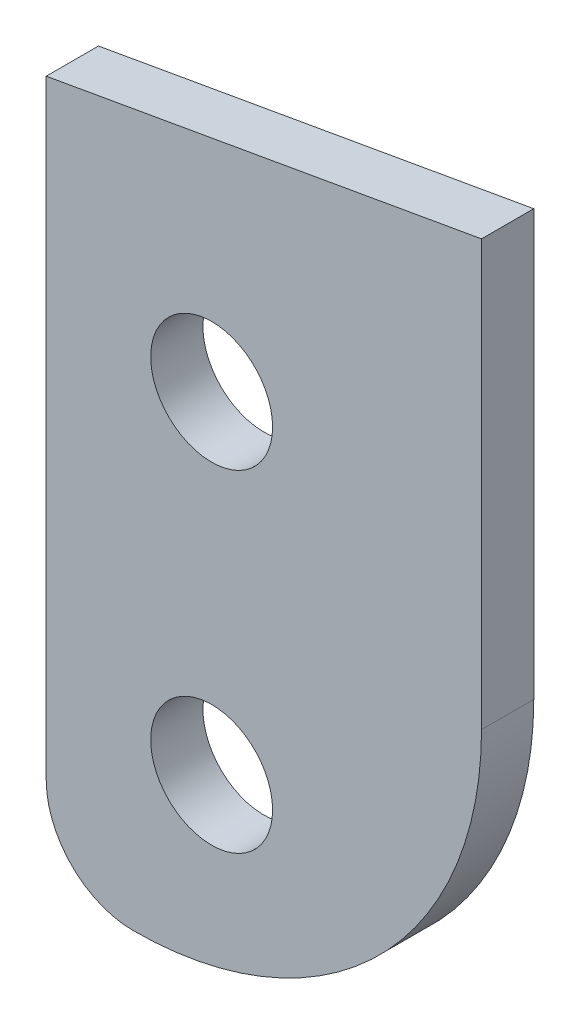
ISO-10303-21;
HEADER;
FILE_DESCRIPTION(('STEP AP214'),'2;1');
FILE_NAME('part.step','',(''),(''),'','','');
FILE_SCHEMA(('AUTOMOTIVE_DESIGN { 1 0 10303 214 1 1 1 1 }'));
ENDSEC;
DATA;
#1=APPLICATION_CONTEXT('core data for automotive mechanical design processes');
#2=APPLICATION_PROTOCOL_DEFINITION('international standard','automotive_design',2000,#1);
#3=PRODUCT_CONTEXT('',#1,'mechanical');
#4=PRODUCT('Part','Part','',(#3));
#5=PRODUCT_RELATED_PRODUCT_CATEGORY('part','',(#4));
#6=PRODUCT_DEFINITION_FORMATION('','',#4);
#7=PRODUCT_DEFINITION_CONTEXT('part definition',#1,'design');
#8=PRODUCT_DEFINITION('design','',#6,#7);
#9=PRODUCT_DEFINITION_SHAPE('','',#8);
#10=(LENGTH_UNIT() NAMED_UNIT(*) SI_UNIT(.MILLI.,.METRE.));
#11=(NAMED_UNIT(*) PLANE_ANGLE_UNIT() SI_UNIT($,.RADIAN.));
#12=(NAMED_UNIT(*) SI_UNIT($,.STERADIAN.) SOLID_ANGLE_UNIT());
#13=UNCERTAINTY_MEASURE_WITH_UNIT(LENGTH_MEASURE(1.E-05),#10,'distance_accuracy_value','');
#14=(GEOMETRIC_REPRESENTATION_CONTEXT(3) GLOBAL_UNCERTAINTY_ASSIGNED_CONTEXT((#13)) GLOBAL_UNIT_ASSIGNED_CONTEXT((#10,
#11,#12)) REPRESENTATION_CONTEXT('',''));
#15=CARTESIAN_POINT('',(0.,0.,0.));
#16=DIRECTION('',(0.,0.,1.));
#17=DIRECTION('',(1.,0.,0.));
#18=AXIS2_PLACEMENT_3D('',#15,#16,#17);
#19=CARTESIAN_POINT('',(50.,0.,6.));
#20=DIRECTION('',(-1.,0.,0.));
#21=DIRECTION('',(0.,-1.,0.));
#22=AXIS2_PLACEMENT_3D('',#19,#20,#21);
#23=PLANE('',#22);
#24=DIRECTION('',(0.,1.,0.));
#25=VECTOR('',#24,1.);
#26=CARTESIAN_POINT('',(50.,0.,6.));
#27=LINE('',#26,#25);
#28=CARTESIAN_POINT('',(50.,40.,6.));
#29=VERTEX_POINT('',#28);
#30=CARTESIAN_POINT('',(50.,88.8163490354231,6.));
#31=VERTEX_POINT('',#30);
#32=EDGE_CURVE('E90',#29,#31,#27,.T.);
#33=ORIENTED_EDGE('',*,*,#32,.F.);
#34=DIRECTION('',(0.,0.,-1.));
#35=VECTOR('',#34,1.);
#36=CARTESIAN_POINT('',(50.,40.,6.));
#37=LINE('',#36,#35);
#38=CARTESIAN_POINT('',(50.,40.,0.));
#39=VERTEX_POINT('',#38);
#40=EDGE_CURVE('E117',#29,#39,#37,.T.);
#41=ORIENTED_EDGE('',*,*,#40,.T.);
#42=DIRECTION('',(0.,1.,0.));
#43=VECTOR('',#42,1.);
#44=CARTESIAN_POINT('',(50.,0.,0.));
#45=LINE('',#44,#43);
#46=CARTESIAN_POINT('',(50.,88.8163490354231,0.));
#47=VERTEX_POINT('',#46);
#48=EDGE_CURVE('E114',#39,#47,#45,.T.);
#49=ORIENTED_EDGE('',*,*,#48,.T.);
#50=DIRECTION('',(0.,0.,-1.));
#51=VECTOR('',#50,1.);
#52=CARTESIAN_POINT('',(50.,88.8163490354231,6.));
#53=LINE('',#52,#51);
#54=EDGE_CURVE('E107',#31,#47,#53,.T.);
#55=ORIENTED_EDGE('',*,*,#54,.F.);
#56=EDGE_LOOP('',(#33,#41,#49,#55));
#57=FACE_BOUND('',#56,.T.);
#58=ADVANCED_FACE('F43',(#57),#23,.F.);
#59=CARTESIAN_POINT('',(0.,80.,6.));
#60=DIRECTION('',(0.173648177666927,-0.984807753012209,0.));
#61=DIRECTION('',(0.984807753012209,0.173648177666927,0.));
#62=AXIS2_PLACEMENT_3D('',#59,#60,#61);
#63=PLANE('',#62);
#64=DIRECTION('',(-0.984807753012209,-0.173648177666927,0.));
#65=VECTOR('',#64,1.);
#66=CARTESIAN_POINT('',(0.,80.,0.));
#67=LINE('',#66,#65);
#68=CARTESIAN_POINT('',(0.,80.,0.));
#69=VERTEX_POINT('',#68);
#70=EDGE_CURVE('E150',#47,#69,#67,.T.);
#71=ORIENTED_EDGE('',*,*,#70,.T.);
#72=DIRECTION('',(0.,0.,-1.));
#73=VECTOR('',#72,1.);
#74=CARTESIAN_POINT('',(0.,80.,6.));
#75=LINE('',#74,#73);
#76=CARTESIAN_POINT('',(0.,80.,6.));
#77=VERTEX_POINT('',#76);
#78=EDGE_CURVE('E109',#77,#69,#75,.T.);
#79=ORIENTED_EDGE('',*,*,#78,.F.);
#80=DIRECTION('',(-0.984807753012209,-0.173648177666927,0.));
#81=VECTOR('',#80,1.);
#82=CARTESIAN_POINT('',(0.,80.,6.));
#83=LINE('',#82,#81);
#84=EDGE_CURVE('E93',#31,#77,#83,.T.);
#85=ORIENTED_EDGE('',*,*,#84,.F.);
#86=ORIENTED_EDGE('',*,*,#54,.T.);
#87=EDGE_LOOP('',(#71,#79,#85,#86));
#88=FACE_BOUND('',#87,.T.);
#89=ADVANCED_FACE('F106',(#88),#63,.F.);
#90=CARTESIAN_POINT('',(0.,0.,6.));
#91=DIRECTION('',(1.,0.,0.));
#92=DIRECTION('',(0.,0.,-1.));
#93=AXIS2_PLACEMENT_3D('',#90,#91,#92);
#94=PLANE('',#93);
#95=DIRECTION('',(0.,-1.,0.));
#96=VECTOR('',#95,1.);
#97=CARTESIAN_POINT('',(0.,0.,0.));
#98=LINE('',#97,#96);
#99=CARTESIAN_POINT('',(0.,10.,0.));
#100=VERTEX_POINT('',#99);
#101=EDGE_CURVE('E102',#69,#100,#98,.T.);
#102=ORIENTED_EDGE('',*,*,#101,.T.);
#103=DIRECTION('',(0.,0.,-1.));
#104=VECTOR('',#103,1.);
#105=CARTESIAN_POINT('',(0.,10.,6.));
#106=LINE('',#105,#104);
#107=CARTESIAN_POINT('',(0.,10.,6.));
#108=VERTEX_POINT('',#107);
#109=EDGE_CURVE('E52',#100,#108,#106,.F.);
#110=ORIENTED_EDGE('',*,*,#109,.T.);
#111=DIRECTION('',(0.,-1.,0.));
#112=VECTOR('',#111,1.);
#113=CARTESIAN_POINT('',(0.,0.,6.));
#114=LINE('',#113,#112);
#115=EDGE_CURVE('E111',#77,#108,#114,.T.);
#116=ORIENTED_EDGE('',*,*,#115,.F.);
#117=ORIENTED_EDGE('',*,*,#78,.T.);
#118=EDGE_LOOP('',(#102,#110,#116,#117));
#119=FACE_BOUND('',#118,.T.);
#120=ADVANCED_FACE('F164',(#119),#94,.F.);
#121=CARTESIAN_POINT('',(0.,0.,6.));
#122=DIRECTION('',(0.,0.,-1.));
#123=DIRECTION('',(-1.,0.,0.));
#124=AXIS2_PLACEMENT_3D('',#121,#122,#123);
#125=PLANE('',#124);
#126=CARTESIAN_POINT('',(19.,58.1,6.));
#127=DIRECTION('',(0.,0.,1.));
#128=DIRECTION('',(1.,0.,0.));
#129=AXIS2_PLACEMENT_3D('',#126,#127,#128);
#130=CIRCLE('',#129,7.);
#131=CARTESIAN_POINT('',(26.,58.1,6.));
#132=VERTEX_POINT('',#131);
#133=EDGE_CURVE('E152',#132,#132,#130,.T.);
#134=ORIENTED_EDGE('',*,*,#133,.F.);
#135=EDGE_LOOP('',(#134));
#136=FACE_BOUND('',#135,.T.);
#137=CARTESIAN_POINT('',(19.,20.,6.));
#138=DIRECTION('',(0.,0.,1.));
#139=DIRECTION('',(1.,0.,0.));
#140=AXIS2_PLACEMENT_3D('',#137,#138,#139);
#141=CIRCLE('',#140,7.);
#142=CARTESIAN_POINT('',(26.,20.,6.));
#143=VERTEX_POINT('',#142);
#144=EDGE_CURVE('E211',#143,#143,#141,.T.);
#145=ORIENTED_EDGE('',*,*,#144,.F.);
#146=EDGE_LOOP('',(#145));
#147=FACE_BOUND('',#146,.T.);
#148=ORIENTED_EDGE('',*,*,#115,.T.);
#149=CARTESIAN_POINT('',(10.,10.,6.));
#150=DIRECTION('',(0.,0.,-1.));
#151=DIRECTION('',(-1.,0.,0.));
#152=AXIS2_PLACEMENT_3D('',#149,#150,#151);
#153=CIRCLE('',#152,10.);
#154=CARTESIAN_POINT('',(10.,0.,6.));
#155=VERTEX_POINT('',#154);
#156=EDGE_CURVE('E11',#108,#155,#153,.F.);
#157=ORIENTED_EDGE('',*,*,#156,.T.);
#158=CARTESIAN_POINT('',(10.,40.,6.));
#159=DIRECTION('',(0.,0.,-1.));
#160=DIRECTION('',(-1.,0.,0.));
#161=AXIS2_PLACEMENT_3D('',#158,#159,#160);
#162=CIRCLE('',#161,40.);
#163=EDGE_CURVE('E96',#155,#29,#162,.F.);
#164=ORIENTED_EDGE('',*,*,#163,.T.);
#165=ORIENTED_EDGE('',*,*,#32,.T.);
#166=ORIENTED_EDGE('',*,*,#84,.T.);
#167=EDGE_LOOP('',(#148,#157,#164,#165,#166));
#168=FACE_BOUND('',#167,.T.);
#169=ADVANCED_FACE('F92',(#136,#147,#168),#125,.F.);
#170=CARTESIAN_POINT('',(0.,0.,0.));
#171=DIRECTION('',(0.,0.,-1.));
#172=DIRECTION('',(-1.,0.,0.));
#173=AXIS2_PLACEMENT_3D('',#170,#171,#172);
#174=PLANE('',#173);
#175=CARTESIAN_POINT('',(19.,58.1,0.));
#176=DIRECTION('',(0.,0.,1.));
#177=DIRECTION('',(1.,0.,0.));
#178=AXIS2_PLACEMENT_3D('',#175,#176,#177);
#179=CIRCLE('',#178,7.);
#180=CARTESIAN_POINT('',(26.,58.1,0.));
#181=VERTEX_POINT('',#180);
#182=EDGE_CURVE('E159',#181,#181,#179,.T.);
#183=ORIENTED_EDGE('',*,*,#182,.T.);
#184=EDGE_LOOP('',(#183));
#185=FACE_BOUND('',#184,.T.);
#186=CARTESIAN_POINT('',(19.,20.,0.));
#187=DIRECTION('',(0.,0.,1.));
#188=DIRECTION('',(1.,0.,0.));
#189=AXIS2_PLACEMENT_3D('',#186,#187,#188);
#190=CIRCLE('',#189,7.);
#191=CARTESIAN_POINT('',(26.,20.,0.));
#192=VERTEX_POINT('',#191);
#193=EDGE_CURVE('E208',#192,#192,#190,.T.);
#194=ORIENTED_EDGE('',*,*,#193,.T.);
#195=EDGE_LOOP('',(#194));
#196=FACE_BOUND('',#195,.T.);
#197=CARTESIAN_POINT('',(10.,40.,0.));
#198=DIRECTION('',(0.,0.,-1.));
#199=DIRECTION('',(-1.,0.,0.));
#200=AXIS2_PLACEMENT_3D('',#197,#198,#199);
#201=CIRCLE('',#200,40.);
#202=CARTESIAN_POINT('',(10.,0.,0.));
#203=VERTEX_POINT('',#202);
#204=EDGE_CURVE('E122',#39,#203,#201,.T.);
#205=ORIENTED_EDGE('',*,*,#204,.T.);
#206=CARTESIAN_POINT('',(10.,10.,0.));
#207=DIRECTION('',(0.,0.,-1.));
#208=DIRECTION('',(-1.,0.,0.));
#209=AXIS2_PLACEMENT_3D('',#206,#207,#208);
#210=CIRCLE('',#209,10.);
#211=EDGE_CURVE('E66',#203,#100,#210,.T.);
#212=ORIENTED_EDGE('',*,*,#211,.T.);
#213=ORIENTED_EDGE('',*,*,#101,.F.);
#214=ORIENTED_EDGE('',*,*,#70,.F.);
#215=ORIENTED_EDGE('',*,*,#48,.F.);
#216=EDGE_LOOP('',(#205,#212,#213,#214,#215));
#217=FACE_BOUND('',#216,.T.);
#218=ADVANCED_FACE('F149',(#185,#196,#217),#174,.T.);
#219=CARTESIAN_POINT('',(19.,20.,6.));
#220=DIRECTION('',(0.,0.,-1.));
#221=DIRECTION('',(-1.,0.,0.));
#222=AXIS2_PLACEMENT_3D('',#219,#220,#221);
#223=CYLINDRICAL_SURFACE('',#222,7.);
#224=ORIENTED_EDGE('',*,*,#144,.T.);
#225=EDGE_LOOP('',(#224));
#226=FACE_BOUND('',#225,.T.);
#227=ORIENTED_EDGE('',*,*,#193,.F.);
#228=EDGE_LOOP('',(#227));
#229=FACE_BOUND('',#228,.T.);
#230=ADVANCED_FACE('F191',(#226,#229),#223,.F.);
#231=CARTESIAN_POINT('',(19.,58.1,6.));
#232=DIRECTION('',(0.,0.,-1.));
#233=DIRECTION('',(-1.,0.,0.));
#234=AXIS2_PLACEMENT_3D('',#231,#232,#233);
#235=CYLINDRICAL_SURFACE('',#234,7.);
#236=ORIENTED_EDGE('',*,*,#133,.T.);
#237=EDGE_LOOP('',(#236));
#238=FACE_BOUND('',#237,.T.);
#239=ORIENTED_EDGE('',*,*,#182,.F.);
#240=EDGE_LOOP('',(#239));
#241=FACE_BOUND('',#240,.T.);
#242=ADVANCED_FACE('F186',(#238,#241),#235,.F.);
#243=CARTESIAN_POINT('',(10.,40.,6.));
#244=DIRECTION('',(0.,0.,-1.));
#245=DIRECTION('',(-1.,0.,0.));
#246=AXIS2_PLACEMENT_3D('',#243,#244,#245);
#247=CYLINDRICAL_SURFACE('',#246,40.);
#248=ORIENTED_EDGE('',*,*,#163,.F.);
#249=DIRECTION('',(0.,0.,-1.));
#250=VECTOR('',#249,1.);
#251=CARTESIAN_POINT('',(10.,0.,6.));
#252=LINE('',#251,#250);
#253=EDGE_CURVE('E129',#203,#155,#252,.F.);
#254=ORIENTED_EDGE('',*,*,#253,.F.);
#255=ORIENTED_EDGE('',*,*,#204,.F.);
#256=ORIENTED_EDGE('',*,*,#40,.F.);
#257=EDGE_LOOP('',(#248,#254,#255,#256));
#258=FACE_BOUND('',#257,.T.);
#259=ADVANCED_FACE('F148',(#258),#247,.T.);
#260=CARTESIAN_POINT('',(10.,10.,6.));
#261=DIRECTION('',(0.,0.,-1.));
#262=DIRECTION('',(-1.,0.,0.));
#263=AXIS2_PLACEMENT_3D('',#260,#261,#262);
#264=CYLINDRICAL_SURFACE('',#263,10.);
#265=ORIENTED_EDGE('',*,*,#156,.F.);
#266=ORIENTED_EDGE('',*,*,#109,.F.);
#267=ORIENTED_EDGE('',*,*,#211,.F.);
#268=ORIENTED_EDGE('',*,*,#253,.T.);
#269=EDGE_LOOP('',(#265,#266,#267,#268));
#270=FACE_BOUND('',#269,.T.);
#271=ADVANCED_FACE('F45',(#270),#264,.T.);
#272=CLOSED_SHELL('',(#58,#89,#120,#169,#218,#230,#242,#259,#271));
#273=MANIFOLD_SOLID_BREP('B2',#272);
#274=ADVANCED_BREP_SHAPE_REPRESENTATION('',(#18,#273),#14);
#275=SHAPE_DEFINITION_REPRESENTATION(#9,#274);
ENDSEC;
END-ISO-10303-21;
